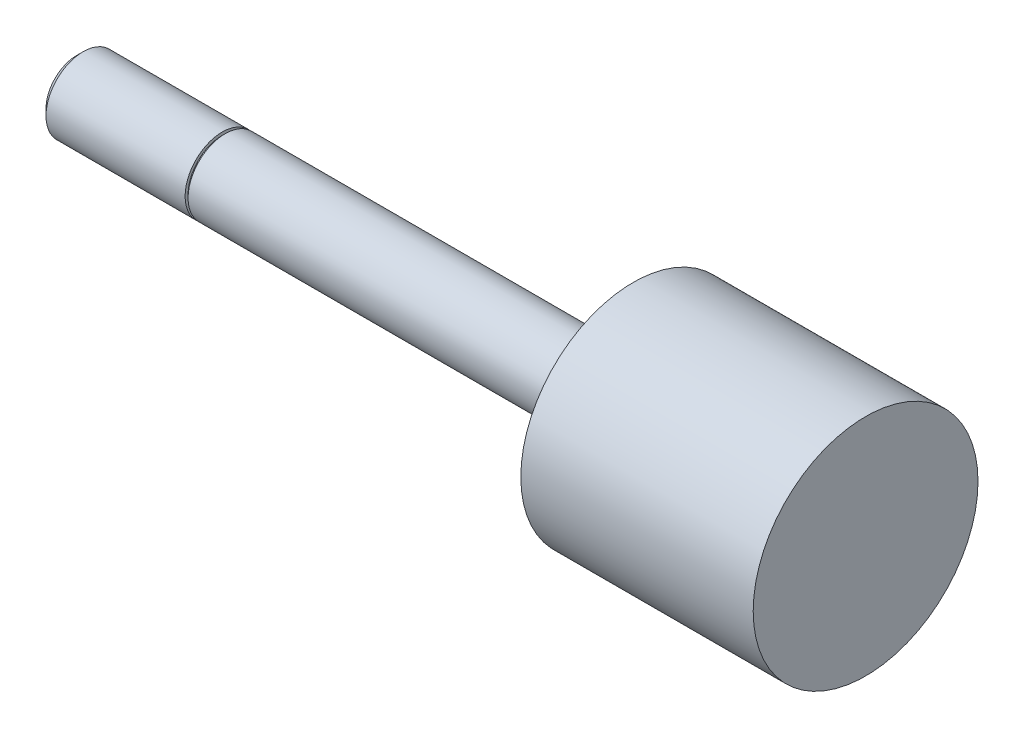
ISO-10303-21;
HEADER;
FILE_DESCRIPTION(('STEP AP214'),'2;1');
FILE_NAME('part.step','',(''),(''),'','','');
FILE_SCHEMA(('AUTOMOTIVE_DESIGN { 1 0 10303 214 1 1 1 1 }'));
ENDSEC;
DATA;
#1=APPLICATION_CONTEXT('core data for automotive mechanical design processes');
#2=APPLICATION_PROTOCOL_DEFINITION('international standard','automotive_design',2000,#1);
#3=PRODUCT_CONTEXT('',#1,'mechanical');
#4=PRODUCT('Part','Part','',(#3));
#5=PRODUCT_RELATED_PRODUCT_CATEGORY('part','',(#4));
#6=PRODUCT_DEFINITION_FORMATION('','',#4);
#7=PRODUCT_DEFINITION_CONTEXT('part definition',#1,'design');
#8=PRODUCT_DEFINITION('design','',#6,#7);
#9=PRODUCT_DEFINITION_SHAPE('','',#8);
#10=(LENGTH_UNIT() NAMED_UNIT(*) SI_UNIT(.MILLI.,.METRE.));
#11=(NAMED_UNIT(*) PLANE_ANGLE_UNIT() SI_UNIT($,.RADIAN.));
#12=(NAMED_UNIT(*) SI_UNIT($,.STERADIAN.) SOLID_ANGLE_UNIT());
#13=UNCERTAINTY_MEASURE_WITH_UNIT(LENGTH_MEASURE(1.E-05),#10,'distance_accuracy_value','');
#14=(GEOMETRIC_REPRESENTATION_CONTEXT(3) GLOBAL_UNCERTAINTY_ASSIGNED_CONTEXT((#13)) GLOBAL_UNIT_ASSIGNED_CONTEXT((#10,
#11,#12)) REPRESENTATION_CONTEXT('',''));
#15=CARTESIAN_POINT('',(0.,0.,0.));
#16=DIRECTION('',(0.,0.,1.));
#17=DIRECTION('',(1.,0.,0.));
#18=AXIS2_PLACEMENT_3D('',#15,#16,#17);
#19=CARTESIAN_POINT('',(-12.7,0.,0.));
#20=DIRECTION('',(1.,0.,0.));
#21=DIRECTION('',(0.,0.,-1.));
#22=AXIS2_PLACEMENT_3D('',#19,#20,#21);
#23=PLANE('',#22);
#24=CARTESIAN_POINT('',(-12.6999999999953,0.,0.));
#25=DIRECTION('',(1.,0.,0.));
#26=DIRECTION('',(0.,0.,-1.));
#27=AXIS2_PLACEMENT_3D('',#24,#25,#26);
#28=CIRCLE('',#27,2.63398000004145);
#29=CARTESIAN_POINT('',(-12.6999999999953,0.,-2.63398000004145));
#30=VERTEX_POINT('',#29);
#31=EDGE_CURVE('E17',#30,#30,#28,.T.);
#32=ORIENTED_EDGE('',*,*,#31,.F.);
#33=EDGE_LOOP('',(#32));
#34=FACE_BOUND('',#33,.T.);
#35=ADVANCED_FACE('F14',(#34),#23,.F.);
#36=CARTESIAN_POINT('',(-12.1589799999242,0.,0.));
#37=DIRECTION('',(1.,0.,0.));
#38=DIRECTION('',(0.,0.,-1.));
#39=AXIS2_PLACEMENT_3D('',#36,#37,#38);
#40=CONICAL_SURFACE('',#39,3.1750000001125,0.785398163397448);
#41=ORIENTED_EDGE('',*,*,#31,.T.);
#42=EDGE_LOOP('',(#41));
#43=FACE_BOUND('',#42,.T.);
#44=CARTESIAN_POINT('',(-12.15898,0.,0.));
#45=DIRECTION('',(-1.,0.,0.));
#46=DIRECTION('',(0.,0.,1.));
#47=AXIS2_PLACEMENT_3D('',#44,#45,#46);
#48=CIRCLE('',#47,3.175);
#49=CARTESIAN_POINT('',(-12.15898,0.,3.175));
#50=VERTEX_POINT('',#49);
#51=EDGE_CURVE('E44',#50,#50,#48,.F.);
#52=ORIENTED_EDGE('',*,*,#51,.F.);
#53=EDGE_LOOP('',(#52));
#54=FACE_BOUND('',#53,.T.);
#55=ADVANCED_FACE('F53',(#43,#54),#40,.T.);
#56=CARTESIAN_POINT('',(54.8132,0.,0.));
#57=DIRECTION('',(-1.,0.,0.));
#58=DIRECTION('',(0.,0.,1.));
#59=AXIS2_PLACEMENT_3D('',#56,#57,#58);
#60=CYLINDRICAL_SURFACE('',#59,3.175);
#61=ORIENTED_EDGE('',*,*,#51,.T.);
#62=EDGE_LOOP('',(#61));
#63=FACE_BOUND('',#62,.T.);
#64=CARTESIAN_POINT('',(-0.253999999999997,0.,0.));
#65=DIRECTION('',(-1.,0.,0.));
#66=DIRECTION('',(0.,0.,1.));
#67=AXIS2_PLACEMENT_3D('',#64,#65,#66);
#68=CIRCLE('',#67,3.175);
#69=CARTESIAN_POINT('',(-0.253999999999997,0.,3.175));
#70=VERTEX_POINT('',#69);
#71=EDGE_CURVE('E42',#70,#70,#68,.T.);
#72=ORIENTED_EDGE('',*,*,#71,.T.);
#73=EDGE_LOOP('',(#72));
#74=FACE_BOUND('',#73,.T.);
#75=ADVANCED_FACE('F61',(#63,#74),#60,.T.);
#76=CARTESIAN_POINT('',(-0.254,3.429,0.));
#77=DIRECTION('',(-1.,0.,0.));
#78=DIRECTION('',(0.,0.,1.));
#79=AXIS2_PLACEMENT_3D('',#76,#77,#78);
#80=PLANE('',#79);
#81=ORIENTED_EDGE('',*,*,#71,.F.);
#82=EDGE_LOOP('',(#81));
#83=FACE_BOUND('',#82,.T.);
#84=CARTESIAN_POINT('',(-0.254,0.,0.));
#85=DIRECTION('',(-1.,0.,0.));
#86=DIRECTION('',(0.,0.,1.));
#87=AXIS2_PLACEMENT_3D('',#84,#85,#86);
#88=CIRCLE('',#87,2.921);
#89=CARTESIAN_POINT('',(-0.254,0.,2.921));
#90=VERTEX_POINT('',#89);
#91=EDGE_CURVE('E40',#90,#90,#88,.F.);
#92=ORIENTED_EDGE('',*,*,#91,.F.);
#93=EDGE_LOOP('',(#92));
#94=FACE_BOUND('',#93,.T.);
#95=ADVANCED_FACE('F88',(#83,#94),#80,.F.);
#96=CARTESIAN_POINT('',(0.,0.,0.));
#97=DIRECTION('',(-1.,0.,0.));
#98=DIRECTION('',(0.,0.,1.));
#99=AXIS2_PLACEMENT_3D('',#96,#97,#98);
#100=CYLINDRICAL_SURFACE('',#99,2.921);
#101=ORIENTED_EDGE('',*,*,#91,.T.);
#102=EDGE_LOOP('',(#101));
#103=FACE_BOUND('',#102,.T.);
#104=CARTESIAN_POINT('',(0.,0.,0.));
#105=DIRECTION('',(-1.,0.,0.));
#106=DIRECTION('',(0.,0.,1.));
#107=AXIS2_PLACEMENT_3D('',#104,#105,#106);
#108=CIRCLE('',#107,2.921);
#109=CARTESIAN_POINT('',(0.,0.,2.921));
#110=VERTEX_POINT('',#109);
#111=EDGE_CURVE('E37',#110,#110,#108,.T.);
#112=ORIENTED_EDGE('',*,*,#111,.T.);
#113=EDGE_LOOP('',(#112));
#114=FACE_BOUND('',#113,.T.);
#115=ADVANCED_FACE('F84',(#103,#114),#100,.T.);
#116=CARTESIAN_POINT('',(0.,2.921,0.));
#117=DIRECTION('',(1.,0.,0.));
#118=DIRECTION('',(0.,0.,-1.));
#119=AXIS2_PLACEMENT_3D('',#116,#117,#118);
#120=PLANE('',#119);
#121=ORIENTED_EDGE('',*,*,#111,.F.);
#122=EDGE_LOOP('',(#121));
#123=FACE_BOUND('',#122,.T.);
#124=CARTESIAN_POINT('',(0.,0.,0.));
#125=DIRECTION('',(-1.,0.,0.));
#126=DIRECTION('',(0.,0.,1.));
#127=AXIS2_PLACEMENT_3D('',#124,#125,#126);
#128=CIRCLE('',#127,3.175);
#129=CARTESIAN_POINT('',(0.,0.,3.175));
#130=VERTEX_POINT('',#129);
#131=EDGE_CURVE('E34',#130,#130,#128,.F.);
#132=ORIENTED_EDGE('',*,*,#131,.F.);
#133=EDGE_LOOP('',(#132));
#134=FACE_BOUND('',#133,.T.);
#135=ADVANCED_FACE('F80',(#123,#134),#120,.F.);
#136=CARTESIAN_POINT('',(54.8132,0.,0.));
#137=DIRECTION('',(-1.,0.,0.));
#138=DIRECTION('',(0.,0.,1.));
#139=AXIS2_PLACEMENT_3D('',#136,#137,#138);
#140=CYLINDRICAL_SURFACE('',#139,3.175);
#141=ORIENTED_EDGE('',*,*,#131,.T.);
#142=EDGE_LOOP('',(#141));
#143=FACE_BOUND('',#142,.T.);
#144=CARTESIAN_POINT('',(34.925,0.,0.));
#145=DIRECTION('',(-1.,0.,0.));
#146=DIRECTION('',(0.,0.,1.));
#147=AXIS2_PLACEMENT_3D('',#144,#145,#146);
#148=CIRCLE('',#147,3.175);
#149=CARTESIAN_POINT('',(34.925,0.,3.175));
#150=VERTEX_POINT('',#149);
#151=EDGE_CURVE('E26',#150,#150,#148,.T.);
#152=ORIENTED_EDGE('',*,*,#151,.T.);
#153=EDGE_LOOP('',(#152));
#154=FACE_BOUND('',#153,.T.);
#155=ADVANCED_FACE('F76',(#143,#154),#140,.T.);
#156=CARTESIAN_POINT('',(54.8132,9.62025,0.));
#157=DIRECTION('',(-1.,0.,0.));
#158=DIRECTION('',(0.,0.,1.));
#159=AXIS2_PLACEMENT_3D('',#156,#157,#158);
#160=PLANE('',#159);
#161=CARTESIAN_POINT('',(54.8132,0.,0.));
#162=DIRECTION('',(-1.,0.,0.));
#163=DIRECTION('',(0.,0.,1.));
#164=AXIS2_PLACEMENT_3D('',#161,#162,#163);
#165=CIRCLE('',#164,9.62025);
#166=CARTESIAN_POINT('',(54.8132,0.,9.62025));
#167=VERTEX_POINT('',#166);
#168=EDGE_CURVE('E21',#167,#167,#165,.T.);
#169=ORIENTED_EDGE('',*,*,#168,.F.);
#170=EDGE_LOOP('',(#169));
#171=FACE_BOUND('',#170,.T.);
#172=ADVANCED_FACE('F69',(#171),#160,.F.);
#173=CARTESIAN_POINT('',(34.925,3.175,0.));
#174=DIRECTION('',(1.,0.,0.));
#175=DIRECTION('',(0.,0.,-1.));
#176=AXIS2_PLACEMENT_3D('',#173,#174,#175);
#177=PLANE('',#176);
#178=ORIENTED_EDGE('',*,*,#151,.F.);
#179=EDGE_LOOP('',(#178));
#180=FACE_BOUND('',#179,.T.);
#181=CARTESIAN_POINT('',(34.925,0.,0.));
#182=DIRECTION('',(-1.,0.,0.));
#183=DIRECTION('',(0.,0.,1.));
#184=AXIS2_PLACEMENT_3D('',#181,#182,#183);
#185=CIRCLE('',#184,9.62025);
#186=CARTESIAN_POINT('',(34.925,0.,9.62025));
#187=VERTEX_POINT('',#186);
#188=EDGE_CURVE('E9',#187,#187,#185,.F.);
#189=ORIENTED_EDGE('',*,*,#188,.F.);
#190=EDGE_LOOP('',(#189));
#191=FACE_BOUND('',#190,.T.);
#192=ADVANCED_FACE('F64',(#180,#191),#177,.F.);
#193=CARTESIAN_POINT('',(54.8132,0.,0.));
#194=DIRECTION('',(-1.,0.,0.));
#195=DIRECTION('',(0.,0.,1.));
#196=AXIS2_PLACEMENT_3D('',#193,#194,#195);
#197=CYLINDRICAL_SURFACE('',#196,9.62025);
#198=ORIENTED_EDGE('',*,*,#188,.T.);
#199=EDGE_LOOP('',(#198));
#200=FACE_BOUND('',#199,.T.);
#201=ORIENTED_EDGE('',*,*,#168,.T.);
#202=EDGE_LOOP('',(#201));
#203=FACE_BOUND('',#202,.T.);
#204=ADVANCED_FACE('F62',(#200,#203),#197,.T.);
#205=CLOSED_SHELL('',(#35,#55,#75,#95,#115,#135,#155,#172,#192,#204));
#206=MANIFOLD_SOLID_BREP('B1',#205);
#207=ADVANCED_BREP_SHAPE_REPRESENTATION('',(#18,#206),#14);
#208=SHAPE_DEFINITION_REPRESENTATION(#9,#207);
ENDSEC;
END-ISO-10303-21;
